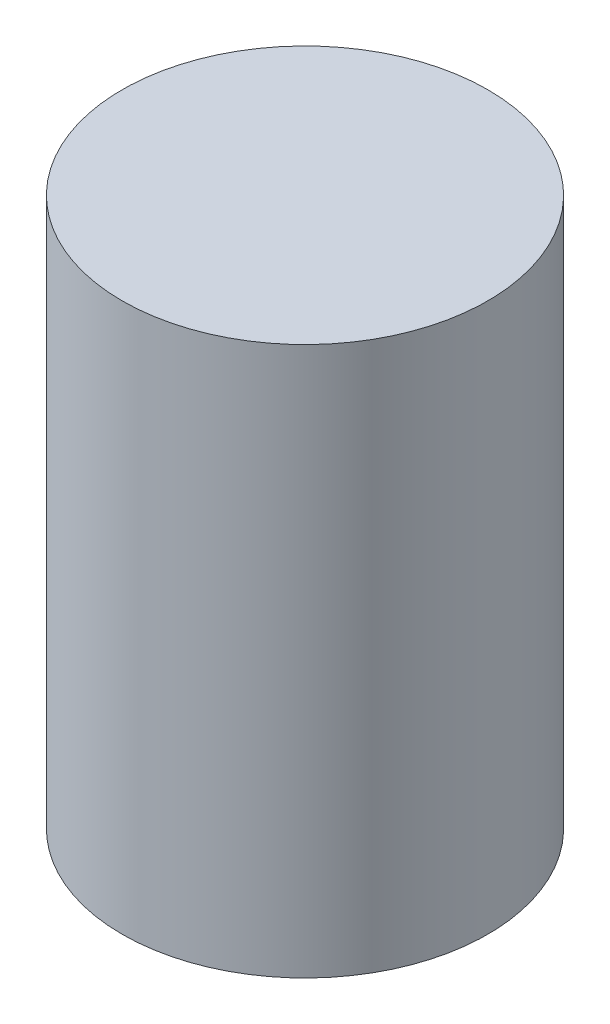
ISO-10303-21;
HEADER;
FILE_DESCRIPTION(('STEP AP214'),'2;1');
FILE_NAME('part.step','',(''),(''),'','','');
FILE_SCHEMA(('AUTOMOTIVE_DESIGN { 1 0 10303 214 1 1 1 1 }'));
ENDSEC;
DATA;
#1=APPLICATION_CONTEXT('core data for automotive mechanical design processes');
#2=APPLICATION_PROTOCOL_DEFINITION('international standard','automotive_design',2000,#1);
#3=PRODUCT_CONTEXT('',#1,'mechanical');
#4=PRODUCT('Part','Part','',(#3));
#5=PRODUCT_RELATED_PRODUCT_CATEGORY('part','',(#4));
#6=PRODUCT_DEFINITION_FORMATION('','',#4);
#7=PRODUCT_DEFINITION_CONTEXT('part definition',#1,'design');
#8=PRODUCT_DEFINITION('design','',#6,#7);
#9=PRODUCT_DEFINITION_SHAPE('','',#8);
#10=(LENGTH_UNIT() NAMED_UNIT(*) SI_UNIT(.MILLI.,.METRE.));
#11=(NAMED_UNIT(*) PLANE_ANGLE_UNIT() SI_UNIT($,.RADIAN.));
#12=(NAMED_UNIT(*) SI_UNIT($,.STERADIAN.) SOLID_ANGLE_UNIT());
#13=UNCERTAINTY_MEASURE_WITH_UNIT(LENGTH_MEASURE(1.E-05),#10,'distance_accuracy_value','');
#14=(GEOMETRIC_REPRESENTATION_CONTEXT(3) GLOBAL_UNCERTAINTY_ASSIGNED_CONTEXT((#13)) GLOBAL_UNIT_ASSIGNED_CONTEXT((#10,
#11,#12)) REPRESENTATION_CONTEXT('',''));
#15=CARTESIAN_POINT('',(0.,0.,0.));
#16=DIRECTION('',(0.,0.,1.));
#17=DIRECTION('',(1.,0.,0.));
#18=AXIS2_PLACEMENT_3D('',#15,#16,#17);
#19=CARTESIAN_POINT('',(0.,76.2,0.));
#20=DIRECTION('',(0.,-1.,0.));
#21=DIRECTION('',(0.,0.,-1.));
#22=AXIS2_PLACEMENT_3D('',#19,#20,#21);
#23=CYLINDRICAL_SURFACE('',#22,25.4);
#24=CARTESIAN_POINT('',(0.,76.2,0.));
#25=DIRECTION('',(0.,1.,0.));
#26=DIRECTION('',(0.,0.,1.));
#27=AXIS2_PLACEMENT_3D('',#24,#25,#26);
#28=CIRCLE('',#27,25.4);
#29=CARTESIAN_POINT('',(0.,76.2,-25.4));
#30=VERTEX_POINT('',#29);
#31=EDGE_CURVE('E41',#30,#30,#28,.T.);
#32=CARTESIAN_POINT('',(0.,0.,0.));
#33=DIRECTION('',(0.,1.,0.));
#34=DIRECTION('',(0.,0.,1.));
#35=AXIS2_PLACEMENT_3D('',#32,#33,#34);
#36=CIRCLE('',#35,25.4);
#37=CARTESIAN_POINT('',(0.,0.,-25.4));
#38=VERTEX_POINT('',#37);
#39=EDGE_CURVE('E43',#38,#38,#36,.T.);
#40=CARTESIAN_POINT('',(0.,76.2,-25.4));
#41=CARTESIAN_POINT('',(0.,75.40625,-25.4));
#42=CARTESIAN_POINT('',(0.,74.6125,-25.4));
#43=CARTESIAN_POINT('',(0.,73.025,-25.4));
#44=CARTESIAN_POINT('',(0.,72.23125,-25.4));
#45=CARTESIAN_POINT('',(0.,70.64375,-25.4));
#46=CARTESIAN_POINT('',(0.,69.85,-25.4));
#47=CARTESIAN_POINT('',(0.,68.2625,-25.4));
#48=CARTESIAN_POINT('',(0.,67.46875,-25.4));
#49=CARTESIAN_POINT('',(0.,65.88125,-25.4));
#50=CARTESIAN_POINT('',(0.,65.0875,-25.4));
#51=CARTESIAN_POINT('',(0.,63.5,-25.4));
#52=CARTESIAN_POINT('',(0.,62.70625,-25.4));
#53=CARTESIAN_POINT('',(0.,61.11875,-25.4));
#54=CARTESIAN_POINT('',(0.,60.325,-25.4));
#55=CARTESIAN_POINT('',(0.,58.7375,-25.4));
#56=CARTESIAN_POINT('',(0.,57.94375,-25.4));
#57=CARTESIAN_POINT('',(0.,56.35625,-25.4));
#58=CARTESIAN_POINT('',(0.,55.5625,-25.4));
#59=CARTESIAN_POINT('',(0.,53.975,-25.4));
#60=CARTESIAN_POINT('',(0.,53.18125,-25.4));
#61=CARTESIAN_POINT('',(0.,51.59375,-25.4));
#62=CARTESIAN_POINT('',(0.,50.8,-25.4));
#63=CARTESIAN_POINT('',(0.,49.2125,-25.4));
#64=CARTESIAN_POINT('',(0.,48.41875,-25.4));
#65=CARTESIAN_POINT('',(0.,46.83125,-25.4));
#66=CARTESIAN_POINT('',(0.,46.0375,-25.4));
#67=CARTESIAN_POINT('',(0.,44.45,-25.4));
#68=CARTESIAN_POINT('',(0.,43.65625,-25.4));
#69=CARTESIAN_POINT('',(0.,42.06875,-25.4));
#70=CARTESIAN_POINT('',(0.,41.275,-25.4));
#71=CARTESIAN_POINT('',(0.,39.6875,-25.4));
#72=CARTESIAN_POINT('',(0.,38.89375,-25.4));
#73=CARTESIAN_POINT('',(0.,37.30625,-25.4));
#74=CARTESIAN_POINT('',(0.,36.5125,-25.4));
#75=CARTESIAN_POINT('',(0.,34.925,-25.4));
#76=CARTESIAN_POINT('',(0.,34.13125,-25.4));
#77=CARTESIAN_POINT('',(0.,32.54375,-25.4));
#78=CARTESIAN_POINT('',(0.,31.75,-25.4));
#79=CARTESIAN_POINT('',(0.,30.1625,-25.4));
#80=CARTESIAN_POINT('',(0.,29.36875,-25.4));
#81=CARTESIAN_POINT('',(0.,27.78125,-25.4));
#82=CARTESIAN_POINT('',(0.,26.9875,-25.4));
#83=CARTESIAN_POINT('',(0.,25.4,-25.4));
#84=CARTESIAN_POINT('',(0.,24.60625,-25.4));
#85=CARTESIAN_POINT('',(0.,23.01875,-25.4));
#86=CARTESIAN_POINT('',(0.,22.225,-25.4));
#87=CARTESIAN_POINT('',(0.,20.6375,-25.4));
#88=CARTESIAN_POINT('',(0.,19.84375,-25.4));
#89=CARTESIAN_POINT('',(0.,18.25625,-25.4));
#90=CARTESIAN_POINT('',(0.,17.4625,-25.4));
#91=CARTESIAN_POINT('',(0.,15.875,-25.4));
#92=CARTESIAN_POINT('',(0.,15.08125,-25.4));
#93=CARTESIAN_POINT('',(0.,13.49375,-25.4));
#94=CARTESIAN_POINT('',(0.,12.7,-25.4));
#95=CARTESIAN_POINT('',(0.,11.1125,-25.4));
#96=CARTESIAN_POINT('',(0.,10.31875,-25.4));
#97=CARTESIAN_POINT('',(0.,8.73125,-25.4));
#98=CARTESIAN_POINT('',(0.,7.93750000000001,-25.4));
#99=CARTESIAN_POINT('',(0.,6.35,-25.4));
#100=CARTESIAN_POINT('',(0.,5.55625,-25.4));
#101=CARTESIAN_POINT('',(0.,3.96875,-25.4));
#102=CARTESIAN_POINT('',(0.,3.175,-25.4));
#103=CARTESIAN_POINT('',(0.,1.5875,-25.4));
#104=CARTESIAN_POINT('',(0.,0.793750000000001,-25.4));
#105=CARTESIAN_POINT('',(0.,0.,-25.4));
#106=B_SPLINE_CURVE_WITH_KNOTS('',3,(#40,#41,#42,#43,#44,#45,#46,#47,#48,#49,#50,#51,#52,#53,
#54,#55,#56,#57,#58,#59,#60,#61,#62,#63,#64,#65,#66,#67,#68,#69,#70,#71,#72,#73,#74,#75,#76,#77,
#78,#79,#80,#81,#82,#83,#84,#85,#86,#87,#88,#89,#90,#91,#92,#93,#94,#95,#96,#97,#98,#99,#100,
#101,#102,#103,#104,#105),.UNSPECIFIED.,.F.,.F.,(4,2,2,2,2,2,2,2,2,2,2,2,2,2,2,2,2,2,2,2,2,2,2,
2,2,2,2,2,2,2,2,2,4),(0.,2.38125,4.7625,7.14375,9.52500000000001,11.90625,14.2875,16.66875,
19.05,21.43125,23.8125,26.19375,28.575,30.95625,33.3375,35.71875,38.1,40.48125,42.8625,45.24375,
47.625,50.00625,52.3875,54.76875,57.15,59.53125,61.9125,64.29375,66.675,69.05625,71.4375,
73.81875,76.2),.UNSPECIFIED.);
#107=EDGE_CURVE('BSEAM30',#30,#38,#106,.T.);
#108=ORIENTED_EDGE('',*,*,#31,.F.);
#109=ORIENTED_EDGE('',*,*,#39,.T.);
#110=ORIENTED_EDGE('',*,*,#107,.T.);
#111=ORIENTED_EDGE('',*,*,#107,.F.);
#112=EDGE_LOOP('',(#108,#110,#109,#111));
#113=FACE_BOUND('',#112,.T.);
#114=ADVANCED_FACE('F30',(#113),#23,.T.);
#115=CARTESIAN_POINT('',(0.,76.2,0.));
#116=DIRECTION('',(0.,1.,0.));
#117=DIRECTION('',(0.,0.,1.));
#118=AXIS2_PLACEMENT_3D('',#115,#116,#117);
#119=PLANE('',#118);
#120=ORIENTED_EDGE('',*,*,#31,.T.);
#121=EDGE_LOOP('',(#120));
#122=FACE_BOUND('',#121,.T.);
#123=ADVANCED_FACE('F60',(#122),#119,.T.);
#124=CARTESIAN_POINT('',(0.,0.,0.));
#125=DIRECTION('',(0.,1.,0.));
#126=DIRECTION('',(0.,0.,1.));
#127=AXIS2_PLACEMENT_3D('',#124,#125,#126);
#128=PLANE('',#127);
#129=CARTESIAN_POINT('',(0.,0.,0.));
#130=DIRECTION('',(0.,-1.,0.));
#131=DIRECTION('',(0.,0.,-1.));
#132=AXIS2_PLACEMENT_3D('',#129,#130,#131);
#133=CIRCLE('',#132,9.525);
#134=CARTESIAN_POINT('',(0.,0.,-9.525));
#135=VERTEX_POINT('',#134);
#136=EDGE_CURVE('E46',#135,#135,#133,.T.);
#137=ORIENTED_EDGE('',*,*,#136,.F.);
#138=EDGE_LOOP('',(#137));
#139=FACE_BOUND('',#138,.T.);
#140=ORIENTED_EDGE('',*,*,#39,.F.);
#141=EDGE_LOOP('',(#140));
#142=FACE_BOUND('',#141,.T.);
#143=ADVANCED_FACE('F57',(#139,#142),#128,.F.);
#144=CARTESIAN_POINT('',(0.,76.201,0.));
#145=DIRECTION('',(0.,-1.,0.));
#146=DIRECTION('',(0.,0.,-1.));
#147=AXIS2_PLACEMENT_3D('',#144,#145,#146);
#148=CYLINDRICAL_SURFACE('',#147,9.525);
#149=CARTESIAN_POINT('',(0.,6.34999999999999,0.));
#150=DIRECTION('',(0.,1.,0.));
#151=DIRECTION('',(0.,0.,1.));
#152=AXIS2_PLACEMENT_3D('',#149,#150,#151);
#153=CIRCLE('',#152,9.525);
#154=CARTESIAN_POINT('',(0.,6.34999999999999,9.525));
#155=VERTEX_POINT('',#154);
#156=EDGE_CURVE('E49',#155,#155,#153,.F.);
#157=ORIENTED_EDGE('',*,*,#156,.F.);
#158=EDGE_LOOP('',(#157));
#159=FACE_BOUND('',#158,.T.);
#160=ORIENTED_EDGE('',*,*,#136,.T.);
#161=EDGE_LOOP('',(#160));
#162=FACE_BOUND('',#161,.T.);
#163=ADVANCED_FACE('F55',(#159,#162),#148,.F.);
#164=CARTESIAN_POINT('',(0.,76.2,0.));
#165=DIRECTION('',(0.,-1.,0.));
#166=DIRECTION('',(0.,0.,-1.));
#167=AXIS2_PLACEMENT_3D('',#164,#165,#166);
#168=CYLINDRICAL_SURFACE('',#167,19.05);
#169=CARTESIAN_POINT('',(0.,69.85,0.));
#170=DIRECTION('',(0.,1.,0.));
#171=DIRECTION('',(0.,0.,1.));
#172=AXIS2_PLACEMENT_3D('',#169,#170,#171);
#173=CIRCLE('',#172,19.05);
#174=CARTESIAN_POINT('',(0.,69.85,-19.05));
#175=VERTEX_POINT('',#174);
#176=EDGE_CURVE('E10',#175,#175,#173,.T.);
#177=CARTESIAN_POINT('',(0.,6.34999999999999,0.));
#178=DIRECTION('',(0.,1.,0.));
#179=DIRECTION('',(0.,0.,1.));
#180=AXIS2_PLACEMENT_3D('',#177,#178,#179);
#181=CIRCLE('',#180,19.05);
#182=CARTESIAN_POINT('',(0.,6.34999999999999,-19.05));
#183=VERTEX_POINT('',#182);
#184=EDGE_CURVE('E34',#183,#183,#181,.T.);
#185=CARTESIAN_POINT('',(0.,69.85,-19.05));
#186=CARTESIAN_POINT('',(0.,69.1885416666667,-19.05));
#187=CARTESIAN_POINT('',(0.,68.5270833333333,-19.05));
#188=CARTESIAN_POINT('',(0.,67.2041666666667,-19.05));
#189=CARTESIAN_POINT('',(0.,66.5427083333333,-19.05));
#190=CARTESIAN_POINT('',(0.,65.2197916666667,-19.05));
#191=CARTESIAN_POINT('',(0.,64.5583333333333,-19.05));
#192=CARTESIAN_POINT('',(0.,63.2354166666667,-19.05));
#193=CARTESIAN_POINT('',(0.,62.5739583333333,-19.05));
#194=CARTESIAN_POINT('',(0.,61.2510416666667,-19.05));
#195=CARTESIAN_POINT('',(0.,60.5895833333333,-19.05));
#196=CARTESIAN_POINT('',(0.,59.2666666666667,-19.05));
#197=CARTESIAN_POINT('',(0.,58.6052083333333,-19.05));
#198=CARTESIAN_POINT('',(0.,57.2822916666667,-19.05));
#199=CARTESIAN_POINT('',(0.,56.6208333333333,-19.05));
#200=CARTESIAN_POINT('',(0.,55.2979166666667,-19.05));
#201=CARTESIAN_POINT('',(0.,54.6364583333333,-19.05));
#202=CARTESIAN_POINT('',(0.,53.3135416666667,-19.05));
#203=CARTESIAN_POINT('',(0.,52.6520833333333,-19.05));
#204=CARTESIAN_POINT('',(0.,51.3291666666667,-19.05));
#205=CARTESIAN_POINT('',(0.,50.6677083333333,-19.05));
#206=CARTESIAN_POINT('',(0.,49.3447916666667,-19.05));
#207=CARTESIAN_POINT('',(0.,48.6833333333333,-19.05));
#208=CARTESIAN_POINT('',(0.,47.3604166666667,-19.05));
#209=CARTESIAN_POINT('',(0.,46.6989583333333,-19.05));
#210=CARTESIAN_POINT('',(0.,45.3760416666667,-19.05));
#211=CARTESIAN_POINT('',(0.,44.7145833333333,-19.05));
#212=CARTESIAN_POINT('',(0.,43.3916666666667,-19.05));
#213=CARTESIAN_POINT('',(0.,42.7302083333333,-19.05));
#214=CARTESIAN_POINT('',(0.,41.4072916666667,-19.05));
#215=CARTESIAN_POINT('',(0.,40.7458333333333,-19.05));
#216=CARTESIAN_POINT('',(0.,39.4229166666667,-19.05));
#217=CARTESIAN_POINT('',(0.,38.7614583333333,-19.05));
#218=CARTESIAN_POINT('',(0.,37.4385416666667,-19.05));
#219=CARTESIAN_POINT('',(0.,36.7770833333333,-19.05));
#220=CARTESIAN_POINT('',(0.,35.4541666666667,-19.05));
#221=CARTESIAN_POINT('',(0.,34.7927083333333,-19.05));
#222=CARTESIAN_POINT('',(0.,33.4697916666667,-19.05));
#223=CARTESIAN_POINT('',(0.,32.8083333333333,-19.05));
#224=CARTESIAN_POINT('',(0.,31.4854166666667,-19.05));
#225=CARTESIAN_POINT('',(0.,30.8239583333333,-19.05));
#226=CARTESIAN_POINT('',(0.,29.5010416666667,-19.05));
#227=CARTESIAN_POINT('',(0.,28.8395833333333,-19.05));
#228=CARTESIAN_POINT('',(0.,27.5166666666667,-19.05));
#229=CARTESIAN_POINT('',(0.,26.8552083333333,-19.05));
#230=CARTESIAN_POINT('',(0.,25.5322916666667,-19.05));
#231=CARTESIAN_POINT('',(0.,24.8708333333333,-19.05));
#232=CARTESIAN_POINT('',(0.,23.5479166666667,-19.05));
#233=CARTESIAN_POINT('',(0.,22.8864583333333,-19.05));
#234=CARTESIAN_POINT('',(0.,21.5635416666667,-19.05));
#235=CARTESIAN_POINT('',(0.,20.9020833333333,-19.05));
#236=CARTESIAN_POINT('',(0.,19.5791666666667,-19.05));
#237=CARTESIAN_POINT('',(0.,18.9177083333333,-19.05));
#238=CARTESIAN_POINT('',(0.,17.5947916666667,-19.05));
#239=CARTESIAN_POINT('',(0.,16.9333333333333,-19.05));
#240=CARTESIAN_POINT('',(0.,15.6104166666666,-19.05));
#241=CARTESIAN_POINT('',(0.,14.9489583333333,-19.05));
#242=CARTESIAN_POINT('',(0.,13.6260416666667,-19.05));
#243=CARTESIAN_POINT('',(0.,12.9645833333333,-19.05));
#244=CARTESIAN_POINT('',(0.,11.6416666666667,-19.05));
#245=CARTESIAN_POINT('',(0.,10.9802083333333,-19.05));
#246=CARTESIAN_POINT('',(0.,9.65729166666666,-19.05));
#247=CARTESIAN_POINT('',(0.,8.99583333333332,-19.05));
#248=CARTESIAN_POINT('',(0.,7.67291666666666,-19.05));
#249=CARTESIAN_POINT('',(0.,7.01145833333333,-19.05));
#250=CARTESIAN_POINT('',(0.,6.34999999999999,-19.05));
#251=B_SPLINE_CURVE_WITH_KNOTS('',3,(#185,#186,#187,#188,#189,#190,#191,#192,#193,#194,#195,
#196,#197,#198,#199,#200,#201,#202,#203,#204,#205,#206,#207,#208,#209,#210,#211,#212,#213,#214,
#215,#216,#217,#218,#219,#220,#221,#222,#223,#224,#225,#226,#227,#228,#229,#230,#231,#232,#233,
#234,#235,#236,#237,#238,#239,#240,#241,#242,#243,#244,#245,#246,#247,#248,#249,#250),
.UNSPECIFIED.,.F.,.F.,(4,2,2,2,2,2,2,2,2,2,2,2,2,2,2,2,2,2,2,2,2,2,2,2,2,2,2,2,2,2,2,2,4),(0.,
1.98437500000001,3.96875000000001,5.953125,7.93750000000001,9.92187500000001,11.90625,13.890625,
15.875,17.859375,19.84375,21.828125,23.8125,25.796875,27.78125,29.765625,31.75,33.734375,
35.71875,37.703125,39.6875,41.671875,43.65625,45.640625,47.625,49.609375,51.59375,53.578125,
55.5625,57.546875,59.53125,61.515625,63.5),.UNSPECIFIED.);
#252=EDGE_CURVE('BSEAM74',#175,#183,#251,.T.);
#253=ORIENTED_EDGE('',*,*,#176,.T.);
#254=ORIENTED_EDGE('',*,*,#184,.F.);
#255=ORIENTED_EDGE('',*,*,#252,.T.);
#256=ORIENTED_EDGE('',*,*,#252,.F.);
#257=EDGE_LOOP('',(#253,#255,#254,#256));
#258=FACE_BOUND('',#257,.T.);
#259=ADVANCED_FACE('F74',(#258),#168,.F.);
#260=CARTESIAN_POINT('',(0.,69.85,0.));
#261=DIRECTION('',(0.,1.,0.));
#262=DIRECTION('',(0.,0.,1.));
#263=AXIS2_PLACEMENT_3D('',#260,#261,#262);
#264=PLANE('',#263);
#265=ORIENTED_EDGE('',*,*,#176,.F.);
#266=EDGE_LOOP('',(#265));
#267=FACE_BOUND('',#266,.T.);
#268=ADVANCED_FACE('F76',(#267),#264,.F.);
#269=CARTESIAN_POINT('',(0.,6.35,0.));
#270=DIRECTION('',(0.,1.,0.));
#271=DIRECTION('',(0.,0.,1.));
#272=AXIS2_PLACEMENT_3D('',#269,#270,#271);
#273=PLANE('',#272);
#274=ORIENTED_EDGE('',*,*,#156,.T.);
#275=EDGE_LOOP('',(#274));
#276=FACE_BOUND('',#275,.T.);
#277=ORIENTED_EDGE('',*,*,#184,.T.);
#278=EDGE_LOOP('',(#277));
#279=FACE_BOUND('',#278,.T.);
#280=ADVANCED_FACE('F32',(#276,#279),#273,.T.);
#281=CLOSED_SHELL('',(#114,#123,#143,#163,#259,#268,#280));
#282=MANIFOLD_SOLID_BREP('B2',#281);
#283=ADVANCED_BREP_SHAPE_REPRESENTATION('',(#18,#282),#14);
#284=SHAPE_DEFINITION_REPRESENTATION(#9,#283);
ENDSEC;
END-ISO-10303-21;
